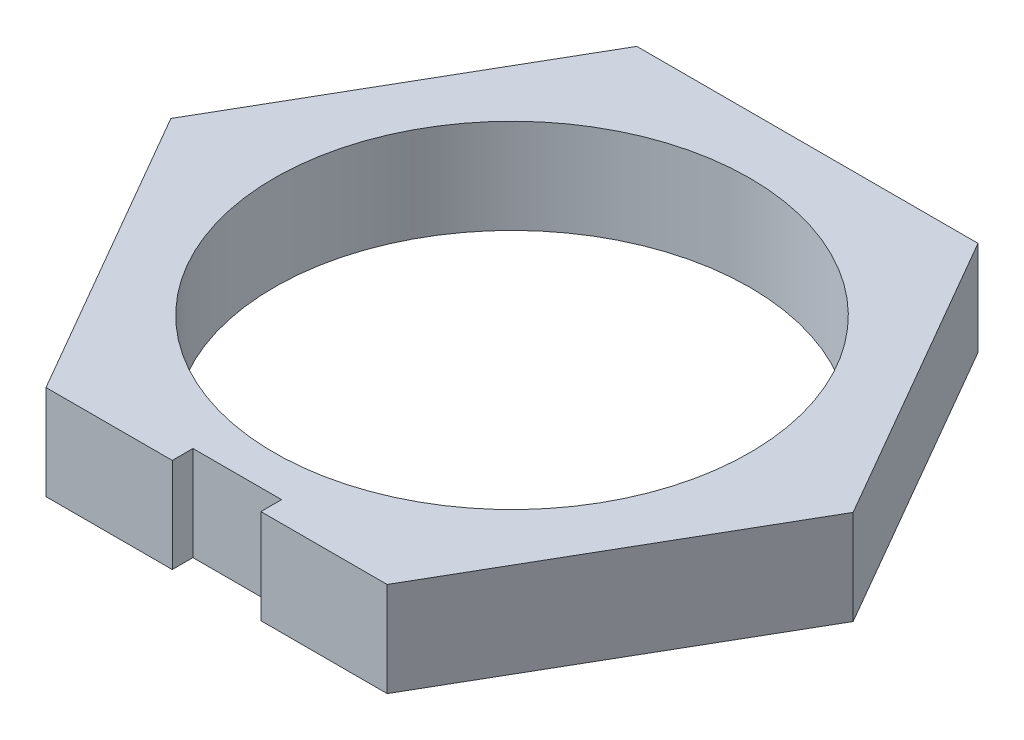
ISO-10303-21;
HEADER;
FILE_DESCRIPTION(('STEP AP214'),'2;1');
FILE_NAME('part.step','',(''),(''),'','','');
FILE_SCHEMA(('AUTOMOTIVE_DESIGN { 1 0 10303 214 1 1 1 1 }'));
ENDSEC;
DATA;
#1=APPLICATION_CONTEXT('core data for automotive mechanical design processes');
#2=APPLICATION_PROTOCOL_DEFINITION('international standard','automotive_design',2000,#1);
#3=PRODUCT_CONTEXT('',#1,'mechanical');
#4=PRODUCT('Part','Part','',(#3));
#5=PRODUCT_RELATED_PRODUCT_CATEGORY('part','',(#4));
#6=PRODUCT_DEFINITION_FORMATION('','',#4);
#7=PRODUCT_DEFINITION_CONTEXT('part definition',#1,'design');
#8=PRODUCT_DEFINITION('design','',#6,#7);
#9=PRODUCT_DEFINITION_SHAPE('','',#8);
#10=(LENGTH_UNIT() NAMED_UNIT(*) SI_UNIT(.MILLI.,.METRE.));
#11=(NAMED_UNIT(*) PLANE_ANGLE_UNIT() SI_UNIT($,.RADIAN.));
#12=(NAMED_UNIT(*) SI_UNIT($,.STERADIAN.) SOLID_ANGLE_UNIT());
#13=UNCERTAINTY_MEASURE_WITH_UNIT(LENGTH_MEASURE(1.E-05),#10,'distance_accuracy_value','');
#14=(GEOMETRIC_REPRESENTATION_CONTEXT(3) GLOBAL_UNCERTAINTY_ASSIGNED_CONTEXT((#13)) GLOBAL_UNIT_ASSIGNED_CONTEXT((#10,
#11,#12)) REPRESENTATION_CONTEXT('',''));
#15=CARTESIAN_POINT('',(0.,0.,0.));
#16=DIRECTION('',(0.,0.,1.));
#17=DIRECTION('',(1.,0.,0.));
#18=AXIS2_PLACEMENT_3D('',#15,#16,#17);
#19=CARTESIAN_POINT('',(-7.33234841870824,-2.032,12.7));
#20=DIRECTION('',(0.,0.,1.));
#21=DIRECTION('',(1.,0.,0.));
#22=AXIS2_PLACEMENT_3D('',#19,#20,#21);
#23=PLANE('',#22);
#24=DIRECTION('',(1.,0.,0.));
#25=VECTOR('',#24,1.);
#26=CARTESIAN_POINT('',(-7.33234841870824,2.032,12.7));
#27=LINE('',#26,#25);
#28=CARTESIAN_POINT('',(-7.33234841870824,2.032,12.7));
#29=VERTEX_POINT('',#28);
#30=CARTESIAN_POINT('',(-1.905,2.032,12.7));
#31=VERTEX_POINT('',#30);
#32=EDGE_CURVE('E139',#29,#31,#27,.T.);
#33=ORIENTED_EDGE('',*,*,#32,.F.);
#34=DIRECTION('',(0.,1.,0.));
#35=VECTOR('',#34,1.);
#36=CARTESIAN_POINT('',(-7.33234841870824,-2.032,12.7));
#37=LINE('',#36,#35);
#38=CARTESIAN_POINT('',(-7.33234841870824,-2.032,12.7));
#39=VERTEX_POINT('',#38);
#40=EDGE_CURVE('E11',#39,#29,#37,.T.);
#41=ORIENTED_EDGE('',*,*,#40,.F.);
#42=DIRECTION('',(1.,0.,0.));
#43=VECTOR('',#42,1.);
#44=CARTESIAN_POINT('',(-7.33234841870824,-2.032,12.7));
#45=LINE('',#44,#43);
#46=CARTESIAN_POINT('',(-1.905,-2.032,12.7));
#47=VERTEX_POINT('',#46);
#48=EDGE_CURVE('E166',#39,#47,#45,.T.);
#49=ORIENTED_EDGE('',*,*,#48,.T.);
#50=DIRECTION('',(0.,1.,0.));
#51=VECTOR('',#50,1.);
#52=CARTESIAN_POINT('',(-1.905,-2.032,12.7));
#53=LINE('',#52,#51);
#54=EDGE_CURVE('E33',#47,#31,#53,.T.);
#55=ORIENTED_EDGE('',*,*,#54,.T.);
#56=EDGE_LOOP('',(#33,#41,#49,#55));
#57=FACE_BOUND('',#56,.T.);
#58=ADVANCED_FACE('F30',(#57),#23,.T.);
#59=CARTESIAN_POINT('',(-14.6646968374165,-2.032,0.));
#60=DIRECTION('',(-0.866025403784438,0.,0.5));
#61=DIRECTION('',(0.5,0.,0.866025403784438));
#62=AXIS2_PLACEMENT_3D('',#59,#60,#61);
#63=PLANE('',#62);
#64=DIRECTION('',(0.5,0.,0.866025403784438));
#65=VECTOR('',#64,1.);
#66=CARTESIAN_POINT('',(-14.6646968374165,2.032,0.));
#67=LINE('',#66,#65);
#68=CARTESIAN_POINT('',(-14.6646968374165,2.032,0.));
#69=VERTEX_POINT('',#68);
#70=EDGE_CURVE('E164',#69,#29,#67,.T.);
#71=ORIENTED_EDGE('',*,*,#70,.F.);
#72=DIRECTION('',(0.,1.,0.));
#73=VECTOR('',#72,1.);
#74=CARTESIAN_POINT('',(-14.6646968374165,-2.032,0.));
#75=LINE('',#74,#73);
#76=CARTESIAN_POINT('',(-14.6646968374165,-2.032,0.));
#77=VERTEX_POINT('',#76);
#78=EDGE_CURVE('E39',#77,#69,#75,.T.);
#79=ORIENTED_EDGE('',*,*,#78,.F.);
#80=DIRECTION('',(0.5,0.,0.866025403784438));
#81=VECTOR('',#80,1.);
#82=CARTESIAN_POINT('',(-14.6646968374165,-2.032,0.));
#83=LINE('',#82,#81);
#84=EDGE_CURVE('E129',#77,#39,#83,.T.);
#85=ORIENTED_EDGE('',*,*,#84,.T.);
#86=ORIENTED_EDGE('',*,*,#40,.T.);
#87=EDGE_LOOP('',(#71,#79,#85,#86));
#88=FACE_BOUND('',#87,.T.);
#89=ADVANCED_FACE('F182',(#88),#63,.T.);
#90=CARTESIAN_POINT('',(-7.33234841870825,-2.032,-12.7));
#91=DIRECTION('',(-0.866025403784439,0.,-0.5));
#92=DIRECTION('',(-0.5,0.,0.866025403784439));
#93=AXIS2_PLACEMENT_3D('',#90,#91,#92);
#94=PLANE('',#93);
#95=DIRECTION('',(-0.5,0.,0.866025403784438));
#96=VECTOR('',#95,1.);
#97=CARTESIAN_POINT('',(-7.33234841870825,2.032,-12.7));
#98=LINE('',#97,#96);
#99=CARTESIAN_POINT('',(-7.33234841870825,2.032,-12.7));
#100=VERTEX_POINT('',#99);
#101=EDGE_CURVE('E116',#100,#69,#98,.T.);
#102=ORIENTED_EDGE('',*,*,#101,.F.);
#103=DIRECTION('',(0.,1.,0.));
#104=VECTOR('',#103,1.);
#105=CARTESIAN_POINT('',(-7.33234841870825,-2.032,-12.7));
#106=LINE('',#105,#104);
#107=CARTESIAN_POINT('',(-7.33234841870825,-2.032,-12.7));
#108=VERTEX_POINT('',#107);
#109=EDGE_CURVE('E111',#108,#100,#106,.T.);
#110=ORIENTED_EDGE('',*,*,#109,.F.);
#111=DIRECTION('',(-0.5,0.,0.866025403784438));
#112=VECTOR('',#111,1.);
#113=CARTESIAN_POINT('',(-7.33234841870825,-2.032,-12.7));
#114=LINE('',#113,#112);
#115=EDGE_CURVE('E114',#108,#77,#114,.T.);
#116=ORIENTED_EDGE('',*,*,#115,.T.);
#117=ORIENTED_EDGE('',*,*,#78,.T.);
#118=EDGE_LOOP('',(#102,#110,#116,#117));
#119=FACE_BOUND('',#118,.T.);
#120=ADVANCED_FACE('F113',(#119),#94,.T.);
#121=CARTESIAN_POINT('',(7.33234841870824,-2.032,-12.7));
#122=DIRECTION('',(0.,0.,-1.));
#123=DIRECTION('',(-1.,0.,0.));
#124=AXIS2_PLACEMENT_3D('',#121,#122,#123);
#125=PLANE('',#124);
#126=DIRECTION('',(-1.,0.,0.));
#127=VECTOR('',#126,1.);
#128=CARTESIAN_POINT('',(7.33234841870824,2.032,-12.7));
#129=LINE('',#128,#127);
#130=CARTESIAN_POINT('',(7.33234841870824,2.032,-12.7));
#131=VERTEX_POINT('',#130);
#132=EDGE_CURVE('E161',#131,#100,#129,.T.);
#133=ORIENTED_EDGE('',*,*,#132,.F.);
#134=DIRECTION('',(0.,1.,0.));
#135=VECTOR('',#134,1.);
#136=CARTESIAN_POINT('',(7.33234841870824,-2.032,-12.7));
#137=LINE('',#136,#135);
#138=CARTESIAN_POINT('',(7.33234841870824,-2.032,-12.7));
#139=VERTEX_POINT('',#138);
#140=EDGE_CURVE('E121',#139,#131,#137,.T.);
#141=ORIENTED_EDGE('',*,*,#140,.F.);
#142=DIRECTION('',(-1.,0.,0.));
#143=VECTOR('',#142,1.);
#144=CARTESIAN_POINT('',(7.33234841870824,-2.032,-12.7));
#145=LINE('',#144,#143);
#146=EDGE_CURVE('E127',#139,#108,#145,.T.);
#147=ORIENTED_EDGE('',*,*,#146,.T.);
#148=ORIENTED_EDGE('',*,*,#109,.T.);
#149=EDGE_LOOP('',(#133,#141,#147,#148));
#150=FACE_BOUND('',#149,.T.);
#151=ADVANCED_FACE('F131',(#150),#125,.T.);
#152=CARTESIAN_POINT('',(14.6646968374165,-2.032,0.));
#153=DIRECTION('',(0.866025403784438,0.,-0.5));
#154=DIRECTION('',(-0.5,0.,-0.866025403784438));
#155=AXIS2_PLACEMENT_3D('',#152,#153,#154);
#156=PLANE('',#155);
#157=DIRECTION('',(-0.5,0.,-0.866025403784438));
#158=VECTOR('',#157,1.);
#159=CARTESIAN_POINT('',(14.6646968374165,2.032,0.));
#160=LINE('',#159,#158);
#161=CARTESIAN_POINT('',(14.6646968374165,2.032,0.));
#162=VERTEX_POINT('',#161);
#163=EDGE_CURVE('E158',#162,#131,#160,.T.);
#164=ORIENTED_EDGE('',*,*,#163,.F.);
#165=DIRECTION('',(0.,1.,0.));
#166=VECTOR('',#165,1.);
#167=CARTESIAN_POINT('',(14.6646968374165,-2.032,0.));
#168=LINE('',#167,#166);
#169=CARTESIAN_POINT('',(14.6646968374165,-2.032,0.));
#170=VERTEX_POINT('',#169);
#171=EDGE_CURVE('E170',#170,#162,#168,.T.);
#172=ORIENTED_EDGE('',*,*,#171,.F.);
#173=DIRECTION('',(-0.5,0.,-0.866025403784438));
#174=VECTOR('',#173,1.);
#175=CARTESIAN_POINT('',(14.6646968374165,-2.032,0.));
#176=LINE('',#175,#174);
#177=EDGE_CURVE('E132',#170,#139,#176,.T.);
#178=ORIENTED_EDGE('',*,*,#177,.T.);
#179=ORIENTED_EDGE('',*,*,#140,.T.);
#180=EDGE_LOOP('',(#164,#172,#178,#179));
#181=FACE_BOUND('',#180,.T.);
#182=ADVANCED_FACE('F195',(#181),#156,.T.);
#183=CARTESIAN_POINT('',(7.33234841870825,-2.032,12.7));
#184=DIRECTION('',(0.866025403784439,0.,0.5));
#185=DIRECTION('',(0.5,0.,-0.866025403784439));
#186=AXIS2_PLACEMENT_3D('',#183,#184,#185);
#187=PLANE('',#186);
#188=DIRECTION('',(0.5,0.,-0.866025403784439));
#189=VECTOR('',#188,1.);
#190=CARTESIAN_POINT('',(7.33234841870825,2.032,12.7));
#191=LINE('',#190,#189);
#192=CARTESIAN_POINT('',(7.33234841870825,2.032,12.7));
#193=VERTEX_POINT('',#192);
#194=EDGE_CURVE('E155',#193,#162,#191,.T.);
#195=ORIENTED_EDGE('',*,*,#194,.F.);
#196=DIRECTION('',(0.,1.,0.));
#197=VECTOR('',#196,1.);
#198=CARTESIAN_POINT('',(7.33234841870825,-2.032,12.7));
#199=LINE('',#198,#197);
#200=CARTESIAN_POINT('',(7.33234841870825,-2.032,12.7));
#201=VERTEX_POINT('',#200);
#202=EDGE_CURVE('E172',#201,#193,#199,.T.);
#203=ORIENTED_EDGE('',*,*,#202,.F.);
#204=DIRECTION('',(0.5,0.,-0.866025403784439));
#205=VECTOR('',#204,1.);
#206=CARTESIAN_POINT('',(7.33234841870825,-2.032,12.7));
#207=LINE('',#206,#205);
#208=EDGE_CURVE('E134',#201,#170,#207,.T.);
#209=ORIENTED_EDGE('',*,*,#208,.T.);
#210=ORIENTED_EDGE('',*,*,#171,.T.);
#211=EDGE_LOOP('',(#195,#203,#209,#210));
#212=FACE_BOUND('',#211,.T.);
#213=ADVANCED_FACE('F198',(#212),#187,.T.);
#214=CARTESIAN_POINT('',(1.905,-2.032,12.7));
#215=DIRECTION('',(0.,0.,1.));
#216=DIRECTION('',(1.,0.,0.));
#217=AXIS2_PLACEMENT_3D('',#214,#215,#216);
#218=PLANE('',#217);
#219=DIRECTION('',(1.,0.,0.));
#220=VECTOR('',#219,1.);
#221=CARTESIAN_POINT('',(1.905,2.032,12.7));
#222=LINE('',#221,#220);
#223=CARTESIAN_POINT('',(1.905,2.032,12.7));
#224=VERTEX_POINT('',#223);
#225=EDGE_CURVE('E152',#224,#193,#222,.T.);
#226=ORIENTED_EDGE('',*,*,#225,.F.);
#227=DIRECTION('',(0.,1.,0.));
#228=VECTOR('',#227,1.);
#229=CARTESIAN_POINT('',(1.905,-2.032,12.7));
#230=LINE('',#229,#228);
#231=CARTESIAN_POINT('',(1.905,-2.032,12.7));
#232=VERTEX_POINT('',#231);
#233=EDGE_CURVE('E174',#232,#224,#230,.T.);
#234=ORIENTED_EDGE('',*,*,#233,.F.);
#235=DIRECTION('',(1.,0.,0.));
#236=VECTOR('',#235,1.);
#237=CARTESIAN_POINT('',(1.905,-2.032,12.7));
#238=LINE('',#237,#236);
#239=EDGE_CURVE('E247',#232,#201,#238,.T.);
#240=ORIENTED_EDGE('',*,*,#239,.T.);
#241=ORIENTED_EDGE('',*,*,#202,.T.);
#242=EDGE_LOOP('',(#226,#234,#240,#241));
#243=FACE_BOUND('',#242,.T.);
#244=ADVANCED_FACE('F202',(#243),#218,.T.);
#245=CARTESIAN_POINT('',(1.905,-2.032,11.811));
#246=DIRECTION('',(-1.,0.,0.));
#247=DIRECTION('',(0.,0.,1.));
#248=AXIS2_PLACEMENT_3D('',#245,#246,#247);
#249=PLANE('',#248);
#250=DIRECTION('',(0.,0.,1.));
#251=VECTOR('',#250,1.);
#252=CARTESIAN_POINT('',(1.905,2.032,11.811));
#253=LINE('',#252,#251);
#254=CARTESIAN_POINT('',(1.905,2.032,11.811));
#255=VERTEX_POINT('',#254);
#256=EDGE_CURVE('E149',#255,#224,#253,.T.);
#257=ORIENTED_EDGE('',*,*,#256,.F.);
#258=DIRECTION('',(0.,1.,0.));
#259=VECTOR('',#258,1.);
#260=CARTESIAN_POINT('',(1.905,-2.032,11.811));
#261=LINE('',#260,#259);
#262=CARTESIAN_POINT('',(1.905,-2.032,11.811));
#263=VERTEX_POINT('',#262);
#264=EDGE_CURVE('E176',#263,#255,#261,.T.);
#265=ORIENTED_EDGE('',*,*,#264,.F.);
#266=DIRECTION('',(0.,0.,1.));
#267=VECTOR('',#266,1.);
#268=CARTESIAN_POINT('',(1.905,-2.032,11.811));
#269=LINE('',#268,#267);
#270=EDGE_CURVE('E244',#263,#232,#269,.T.);
#271=ORIENTED_EDGE('',*,*,#270,.T.);
#272=ORIENTED_EDGE('',*,*,#233,.T.);
#273=EDGE_LOOP('',(#257,#265,#271,#272));
#274=FACE_BOUND('',#273,.T.);
#275=ADVANCED_FACE('F206',(#274),#249,.T.);
#276=CARTESIAN_POINT('',(-1.905,-2.032,11.811));
#277=DIRECTION('',(0.,0.,1.));
#278=DIRECTION('',(1.,0.,0.));
#279=AXIS2_PLACEMENT_3D('',#276,#277,#278);
#280=PLANE('',#279);
#281=DIRECTION('',(1.,0.,0.));
#282=VECTOR('',#281,1.);
#283=CARTESIAN_POINT('',(-1.905,2.032,11.811));
#284=LINE('',#283,#282);
#285=CARTESIAN_POINT('',(-1.905,2.032,11.811));
#286=VERTEX_POINT('',#285);
#287=EDGE_CURVE('E146',#286,#255,#284,.T.);
#288=ORIENTED_EDGE('',*,*,#287,.F.);
#289=DIRECTION('',(0.,1.,0.));
#290=VECTOR('',#289,1.);
#291=CARTESIAN_POINT('',(-1.905,-2.032,11.811));
#292=LINE('',#291,#290);
#293=CARTESIAN_POINT('',(-1.905,-2.032,11.811));
#294=VERTEX_POINT('',#293);
#295=EDGE_CURVE('E177',#294,#286,#292,.T.);
#296=ORIENTED_EDGE('',*,*,#295,.F.);
#297=DIRECTION('',(1.,0.,0.));
#298=VECTOR('',#297,1.);
#299=CARTESIAN_POINT('',(-1.905,-2.032,11.811));
#300=LINE('',#299,#298);
#301=EDGE_CURVE('E241',#294,#263,#300,.T.);
#302=ORIENTED_EDGE('',*,*,#301,.T.);
#303=ORIENTED_EDGE('',*,*,#264,.T.);
#304=EDGE_LOOP('',(#288,#296,#302,#303));
#305=FACE_BOUND('',#304,.T.);
#306=ADVANCED_FACE('F210',(#305),#280,.T.);
#307=CARTESIAN_POINT('',(-1.905,-2.032,12.7));
#308=DIRECTION('',(1.,0.,0.));
#309=DIRECTION('',(0.,0.,-1.));
#310=AXIS2_PLACEMENT_3D('',#307,#308,#309);
#311=PLANE('',#310);
#312=DIRECTION('',(0.,0.,-1.));
#313=VECTOR('',#312,1.);
#314=CARTESIAN_POINT('',(-1.905,2.032,12.7));
#315=LINE('',#314,#313);
#316=EDGE_CURVE('E142',#31,#286,#315,.T.);
#317=ORIENTED_EDGE('',*,*,#316,.F.);
#318=ORIENTED_EDGE('',*,*,#54,.F.);
#319=DIRECTION('',(0.,0.,-1.));
#320=VECTOR('',#319,1.);
#321=CARTESIAN_POINT('',(-1.905,-2.032,12.7));
#322=LINE('',#321,#320);
#323=EDGE_CURVE('E239',#47,#294,#322,.T.);
#324=ORIENTED_EDGE('',*,*,#323,.T.);
#325=ORIENTED_EDGE('',*,*,#295,.T.);
#326=EDGE_LOOP('',(#317,#318,#324,#325));
#327=FACE_BOUND('',#326,.T.);
#328=ADVANCED_FACE('F179',(#327),#311,.T.);
#329=CARTESIAN_POINT('',(-1.905,-2.032,12.7));
#330=DIRECTION('',(0.,1.,0.));
#331=DIRECTION('',(0.,0.,1.));
#332=AXIS2_PLACEMENT_3D('',#329,#330,#331);
#333=PLANE('',#332);
#334=CARTESIAN_POINT('',(0.,-2.032,0.));
#335=DIRECTION('',(0.,1.,0.));
#336=DIRECTION('',(0.,0.,-1.));
#337=AXIS2_PLACEMENT_3D('',#334,#335,#336);
#338=CIRCLE('',#337,10.2235);
#339=CARTESIAN_POINT('',(0.,-2.032,-10.2235));
#340=VERTEX_POINT('',#339);
#341=EDGE_CURVE('E143',#340,#340,#338,.T.);
#342=ORIENTED_EDGE('',*,*,#341,.T.);
#343=EDGE_LOOP('',(#342));
#344=FACE_BOUND('',#343,.T.);
#345=ORIENTED_EDGE('',*,*,#48,.F.);
#346=ORIENTED_EDGE('',*,*,#84,.F.);
#347=ORIENTED_EDGE('',*,*,#115,.F.);
#348=ORIENTED_EDGE('',*,*,#146,.F.);
#349=ORIENTED_EDGE('',*,*,#177,.F.);
#350=ORIENTED_EDGE('',*,*,#208,.F.);
#351=ORIENTED_EDGE('',*,*,#239,.F.);
#352=ORIENTED_EDGE('',*,*,#270,.F.);
#353=ORIENTED_EDGE('',*,*,#301,.F.);
#354=ORIENTED_EDGE('',*,*,#323,.F.);
#355=EDGE_LOOP('',(#345,#346,#347,#348,#349,#350,#351,#352,#353,#354));
#356=FACE_BOUND('',#355,.T.);
#357=ADVANCED_FACE('F125',(#344,#356),#333,.F.);
#358=CARTESIAN_POINT('',(-1.905,2.032,12.7));
#359=DIRECTION('',(0.,1.,0.));
#360=DIRECTION('',(0.,0.,1.));
#361=AXIS2_PLACEMENT_3D('',#358,#359,#360);
#362=PLANE('',#361);
#363=CARTESIAN_POINT('',(0.,2.032,0.));
#364=DIRECTION('',(0.,1.,0.));
#365=DIRECTION('',(0.,0.,-1.));
#366=AXIS2_PLACEMENT_3D('',#363,#364,#365);
#367=CIRCLE('',#366,10.2235);
#368=CARTESIAN_POINT('',(0.,2.032,-10.2235));
#369=VERTEX_POINT('',#368);
#370=EDGE_CURVE('E234',#369,#369,#367,.T.);
#371=ORIENTED_EDGE('',*,*,#370,.F.);
#372=EDGE_LOOP('',(#371));
#373=FACE_BOUND('',#372,.T.);
#374=ORIENTED_EDGE('',*,*,#32,.T.);
#375=ORIENTED_EDGE('',*,*,#316,.T.);
#376=ORIENTED_EDGE('',*,*,#287,.T.);
#377=ORIENTED_EDGE('',*,*,#256,.T.);
#378=ORIENTED_EDGE('',*,*,#225,.T.);
#379=ORIENTED_EDGE('',*,*,#194,.T.);
#380=ORIENTED_EDGE('',*,*,#163,.T.);
#381=ORIENTED_EDGE('',*,*,#132,.T.);
#382=ORIENTED_EDGE('',*,*,#101,.T.);
#383=ORIENTED_EDGE('',*,*,#70,.T.);
#384=EDGE_LOOP('',(#374,#375,#376,#377,#378,#379,#380,#381,#382,#383));
#385=FACE_BOUND('',#384,.T.);
#386=ADVANCED_FACE('F181',(#373,#385),#362,.T.);
#387=CARTESIAN_POINT('',(0.,-2.032,0.));
#388=DIRECTION('',(0.,1.,0.));
#389=DIRECTION('',(0.,0.,1.));
#390=AXIS2_PLACEMENT_3D('',#387,#388,#389);
#391=CYLINDRICAL_SURFACE('',#390,10.2235);
#392=ORIENTED_EDGE('',*,*,#341,.F.);
#393=EDGE_LOOP('',(#392));
#394=FACE_BOUND('',#393,.T.);
#395=ORIENTED_EDGE('',*,*,#370,.T.);
#396=EDGE_LOOP('',(#395));
#397=FACE_BOUND('',#396,.T.);
#398=ADVANCED_FACE('F222',(#394,#397),#391,.F.);
#399=CLOSED_SHELL('',(#58,#89,#120,#151,#182,#213,#244,#275,#306,#328,#357,#386,#398));
#400=MANIFOLD_SOLID_BREP('B2',#399);
#401=ADVANCED_BREP_SHAPE_REPRESENTATION('',(#18,#400),#14);
#402=SHAPE_DEFINITION_REPRESENTATION(#9,#401);
ENDSEC;
END-ISO-10303-21;
